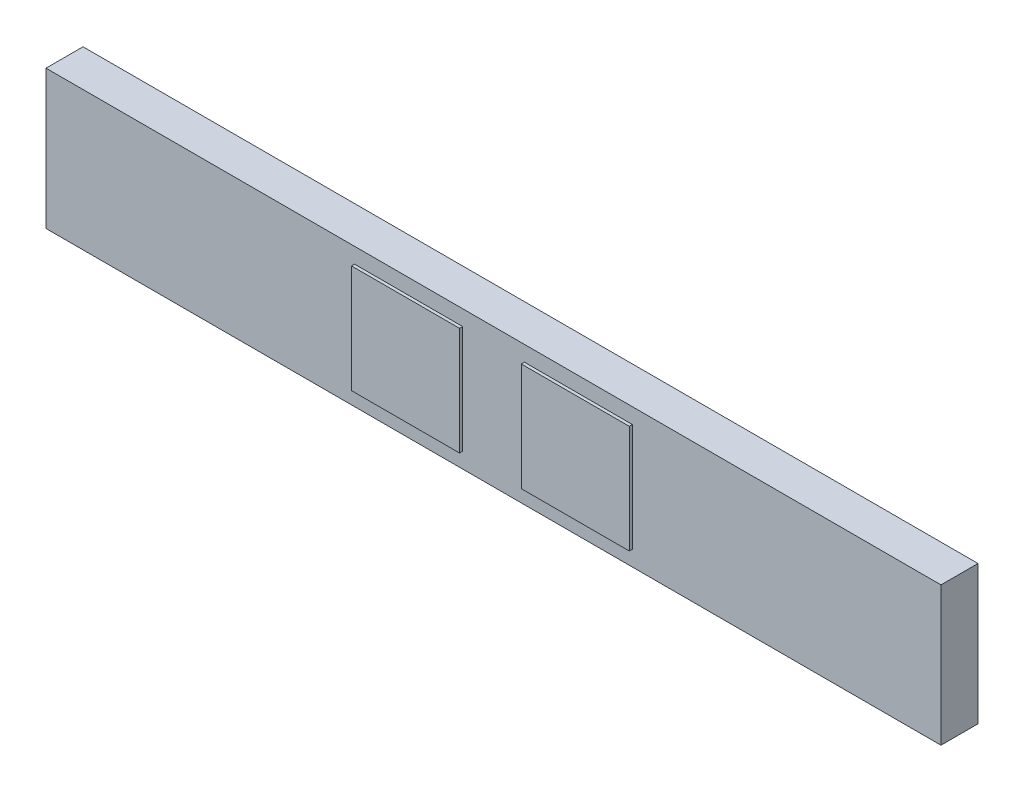
ISO-10303-21;
HEADER;
FILE_DESCRIPTION(('STEP AP214'),'2;1');
FILE_NAME('part.step','',(''),(''),'','','');
FILE_SCHEMA(('AUTOMOTIVE_DESIGN { 1 0 10303 214 1 1 1 1 }'));
ENDSEC;
DATA;
#1=APPLICATION_CONTEXT('core data for automotive mechanical design processes');
#2=APPLICATION_PROTOCOL_DEFINITION('international standard','automotive_design',2000,#1);
#3=PRODUCT_CONTEXT('',#1,'mechanical');
#4=PRODUCT('Part','Part','',(#3));
#5=PRODUCT_RELATED_PRODUCT_CATEGORY('part','',(#4));
#6=PRODUCT_DEFINITION_FORMATION('','',#4);
#7=PRODUCT_DEFINITION_CONTEXT('part definition',#1,'design');
#8=PRODUCT_DEFINITION('design','',#6,#7);
#9=PRODUCT_DEFINITION_SHAPE('','',#8);
#10=(LENGTH_UNIT() NAMED_UNIT(*) SI_UNIT(.MILLI.,.METRE.));
#11=(NAMED_UNIT(*) PLANE_ANGLE_UNIT() SI_UNIT($,.RADIAN.));
#12=(NAMED_UNIT(*) SI_UNIT($,.STERADIAN.) SOLID_ANGLE_UNIT());
#13=UNCERTAINTY_MEASURE_WITH_UNIT(LENGTH_MEASURE(1.E-05),#10,'distance_accuracy_value','');
#14=(GEOMETRIC_REPRESENTATION_CONTEXT(3) GLOBAL_UNCERTAINTY_ASSIGNED_CONTEXT((#13)) GLOBAL_UNIT_ASSIGNED_CONTEXT((#10,
#11,#12)) REPRESENTATION_CONTEXT('',''));
#15=CARTESIAN_POINT('',(0.,0.,0.));
#16=DIRECTION('',(0.,0.,1.));
#17=DIRECTION('',(1.,0.,0.));
#18=AXIS2_PLACEMENT_3D('',#15,#16,#17);
#19=CARTESIAN_POINT('',(-14.5000000000116,12.5,3.7));
#20=DIRECTION('',(0.,0.,1.));
#21=DIRECTION('',(1.,0.,0.));
#22=AXIS2_PLACEMENT_3D('',#19,#20,#21);
#23=PLANE('',#22);
#24=DIRECTION('',(-1.,0.,0.));
#25=VECTOR('',#24,1.);
#26=CARTESIAN_POINT('',(4.5000000000029,16.5,3.7));
#27=LINE('',#26,#25);
#28=CARTESIAN_POINT('',(4.5000000000029,16.5,3.7));
#29=VERTEX_POINT('',#28);
#30=CARTESIAN_POINT('',(1.0000000000029,16.5,3.7));
#31=VERTEX_POINT('',#30);
#32=EDGE_CURVE('E156',#29,#31,#27,.T.);
#33=ORIENTED_EDGE('',*,*,#32,.F.);
#34=DIRECTION('',(0.,1.,0.));
#35=VECTOR('',#34,1.);
#36=CARTESIAN_POINT('',(4.5000000000029,13.,3.7));
#37=LINE('',#36,#35);
#38=CARTESIAN_POINT('',(4.5000000000029,13.,3.7));
#39=VERTEX_POINT('',#38);
#40=EDGE_CURVE('E153',#39,#29,#37,.T.);
#41=ORIENTED_EDGE('',*,*,#40,.F.);
#42=DIRECTION('',(1.,0.,0.));
#43=VECTOR('',#42,1.);
#44=CARTESIAN_POINT('',(4.5000000000029,13.,3.7));
#45=LINE('',#44,#43);
#46=CARTESIAN_POINT('',(1.0000000000029,13.,3.7));
#47=VERTEX_POINT('',#46);
#48=EDGE_CURVE('E165',#47,#39,#45,.T.);
#49=ORIENTED_EDGE('',*,*,#48,.F.);
#50=DIRECTION('',(0.,-1.,0.));
#51=VECTOR('',#50,1.);
#52=CARTESIAN_POINT('',(1.0000000000029,13.,3.7));
#53=LINE('',#52,#51);
#54=EDGE_CURVE('E173',#31,#47,#53,.T.);
#55=ORIENTED_EDGE('',*,*,#54,.F.);
#56=EDGE_LOOP('',(#33,#41,#49,#55));
#57=FACE_BOUND('',#56,.T.);
#58=DIRECTION('',(0.,1.,0.));
#59=VECTOR('',#58,1.);
#60=CARTESIAN_POINT('',(14.5000000000116,14.7500000000058,3.7));
#61=LINE('',#60,#59);
#62=CARTESIAN_POINT('',(14.5000000000029,12.5,3.7));
#63=VERTEX_POINT('',#62);
#64=CARTESIAN_POINT('',(14.5000000000116,17.0000000000116,3.7));
#65=VERTEX_POINT('',#64);
#66=EDGE_CURVE('E186',#63,#65,#61,.T.);
#67=ORIENTED_EDGE('',*,*,#66,.T.);
#68=DIRECTION('',(1.,0.,0.));
#69=VECTOR('',#68,1.);
#70=CARTESIAN_POINT('',(0.,17.0000000000116,3.7));
#71=LINE('',#70,#69);
#72=CARTESIAN_POINT('',(-14.5000000000116,17.0000000000116,3.7));
#73=VERTEX_POINT('',#72);
#74=EDGE_CURVE('E11',#73,#65,#71,.T.);
#75=ORIENTED_EDGE('',*,*,#74,.F.);
#76=DIRECTION('',(0.,-1.,0.));
#77=VECTOR('',#76,1.);
#78=CARTESIAN_POINT('',(-14.5000000000116,14.7500000000058,3.7));
#79=LINE('',#78,#77);
#80=CARTESIAN_POINT('',(-14.5000000000116,12.5,3.7));
#81=VERTEX_POINT('',#80);
#82=EDGE_CURVE('E192',#73,#81,#79,.T.);
#83=ORIENTED_EDGE('',*,*,#82,.T.);
#84=DIRECTION('',(1.,0.,0.));
#85=VECTOR('',#84,1.);
#86=CARTESIAN_POINT('',(0.,12.5,3.7));
#87=LINE('',#86,#85);
#88=EDGE_CURVE('E189',#81,#63,#87,.T.);
#89=ORIENTED_EDGE('',*,*,#88,.T.);
#90=EDGE_LOOP('',(#67,#75,#83,#89));
#91=FACE_BOUND('',#90,.T.);
#92=DIRECTION('',(-1.,0.,0.));
#93=VECTOR('',#92,1.);
#94=CARTESIAN_POINT('',(-1.0000000000116,16.5,3.7));
#95=LINE('',#94,#93);
#96=CARTESIAN_POINT('',(-1.0000000000116,16.5,3.7));
#97=VERTEX_POINT('',#96);
#98=CARTESIAN_POINT('',(-4.5000000000116,16.5,3.7));
#99=VERTEX_POINT('',#98);
#100=EDGE_CURVE('E383',#97,#99,#95,.T.);
#101=ORIENTED_EDGE('',*,*,#100,.F.);
#102=DIRECTION('',(0.,1.,0.));
#103=VECTOR('',#102,1.);
#104=CARTESIAN_POINT('',(-1.0000000000116,13.,3.7));
#105=LINE('',#104,#103);
#106=CARTESIAN_POINT('',(-1.0000000000116,13.,3.7));
#107=VERTEX_POINT('',#106);
#108=EDGE_CURVE('E151',#107,#97,#105,.T.);
#109=ORIENTED_EDGE('',*,*,#108,.F.);
#110=DIRECTION('',(1.,0.,0.));
#111=VECTOR('',#110,1.);
#112=CARTESIAN_POINT('',(-1.0000000000116,13.,3.7));
#113=LINE('',#112,#111);
#114=CARTESIAN_POINT('',(-4.5000000000116,13.,3.7));
#115=VERTEX_POINT('',#114);
#116=EDGE_CURVE('E147',#115,#107,#113,.T.);
#117=ORIENTED_EDGE('',*,*,#116,.F.);
#118=DIRECTION('',(0.,-1.,0.));
#119=VECTOR('',#118,1.);
#120=CARTESIAN_POINT('',(-4.5000000000116,13.,3.7));
#121=LINE('',#120,#119);
#122=EDGE_CURVE('E380',#99,#115,#121,.T.);
#123=ORIENTED_EDGE('',*,*,#122,.F.);
#124=EDGE_LOOP('',(#101,#109,#117,#123));
#125=FACE_BOUND('',#124,.T.);
#126=ADVANCED_FACE('F36',(#57,#91,#125),#23,.T.);
#127=CARTESIAN_POINT('',(-14.5000000000116,17.0000000000116,2.5));
#128=DIRECTION('',(-1.,0.,0.));
#129=DIRECTION('',(0.,-1.,0.));
#130=AXIS2_PLACEMENT_3D('',#127,#128,#129);
#131=PLANE('',#130);
#132=ORIENTED_EDGE('',*,*,#82,.F.);
#133=DIRECTION('',(0.,0.,-1.));
#134=VECTOR('',#133,1.);
#135=CARTESIAN_POINT('',(-14.5000000000116,17.0000000000116,3.1));
#136=LINE('',#135,#134);
#137=CARTESIAN_POINT('',(-14.5000000000116,17.0000000000116,2.5));
#138=VERTEX_POINT('',#137);
#139=EDGE_CURVE('E40',#73,#138,#136,.T.);
#140=ORIENTED_EDGE('',*,*,#139,.T.);
#141=DIRECTION('',(0.,1.,0.));
#142=VECTOR('',#141,1.);
#143=CARTESIAN_POINT('',(-14.5000000000116,14.7500000000058,2.5));
#144=LINE('',#143,#142);
#145=CARTESIAN_POINT('',(-14.5000000000116,12.5,2.5));
#146=VERTEX_POINT('',#145);
#147=EDGE_CURVE('E201',#146,#138,#144,.T.);
#148=ORIENTED_EDGE('',*,*,#147,.F.);
#149=DIRECTION('',(0.,0.,-1.));
#150=VECTOR('',#149,1.);
#151=CARTESIAN_POINT('',(-14.5000000000116,12.5,3.1));
#152=LINE('',#151,#150);
#153=EDGE_CURVE('E207',#81,#146,#152,.T.);
#154=ORIENTED_EDGE('',*,*,#153,.F.);
#155=EDGE_LOOP('',(#132,#140,#148,#154));
#156=FACE_BOUND('',#155,.T.);
#157=ADVANCED_FACE('F214',(#156),#131,.T.);
#158=CARTESIAN_POINT('',(-14.5000000000116,12.5,2.5));
#159=DIRECTION('',(0.,-1.,0.));
#160=DIRECTION('',(1.,0.,0.));
#161=AXIS2_PLACEMENT_3D('',#158,#159,#160);
#162=PLANE('',#161);
#163=ORIENTED_EDGE('',*,*,#88,.F.);
#164=ORIENTED_EDGE('',*,*,#153,.T.);
#165=DIRECTION('',(-1.,0.,0.));
#166=VECTOR('',#165,1.);
#167=CARTESIAN_POINT('',(0.,12.5,2.5));
#168=LINE('',#167,#166);
#169=CARTESIAN_POINT('',(14.5000000000029,12.5,2.5));
#170=VERTEX_POINT('',#169);
#171=EDGE_CURVE('E195',#170,#146,#168,.T.);
#172=ORIENTED_EDGE('',*,*,#171,.F.);
#173=DIRECTION('',(0.,0.,-1.));
#174=VECTOR('',#173,1.);
#175=CARTESIAN_POINT('',(14.5,12.5,3.1));
#176=LINE('',#175,#174);
#177=EDGE_CURVE('E204',#63,#170,#176,.T.);
#178=ORIENTED_EDGE('',*,*,#177,.F.);
#179=EDGE_LOOP('',(#163,#164,#172,#178));
#180=FACE_BOUND('',#179,.T.);
#181=ADVANCED_FACE('F224',(#180),#162,.T.);
#182=CARTESIAN_POINT('',(14.5,12.5,2.5));
#183=DIRECTION('',(1.,-2.57741359118912E-12,0.));
#184=DIRECTION('',(2.57741359118912E-12,1.,0.));
#185=AXIS2_PLACEMENT_3D('',#182,#183,#184);
#186=PLANE('',#185);
#187=ORIENTED_EDGE('',*,*,#66,.F.);
#188=ORIENTED_EDGE('',*,*,#177,.T.);
#189=DIRECTION('',(0.,-1.,0.));
#190=VECTOR('',#189,1.);
#191=CARTESIAN_POINT('',(14.5000000000116,14.7500000000058,2.5));
#192=LINE('',#191,#190);
#193=CARTESIAN_POINT('',(14.5000000000116,17.0000000000116,2.5));
#194=VERTEX_POINT('',#193);
#195=EDGE_CURVE('E198',#194,#170,#192,.T.);
#196=ORIENTED_EDGE('',*,*,#195,.F.);
#197=DIRECTION('',(0.,0.,1.));
#198=VECTOR('',#197,1.);
#199=CARTESIAN_POINT('',(14.5000000000116,17.0000000000116,3.1));
#200=LINE('',#199,#198);
#201=EDGE_CURVE('E206',#194,#65,#200,.T.);
#202=ORIENTED_EDGE('',*,*,#201,.T.);
#203=EDGE_LOOP('',(#187,#188,#196,#202));
#204=FACE_BOUND('',#203,.T.);
#205=ADVANCED_FACE('F223',(#204),#186,.T.);
#206=CARTESIAN_POINT('',(14.5000000000116,12.5,2.5));
#207=DIRECTION('',(0.,0.,-1.));
#208=DIRECTION('',(-1.,0.,0.));
#209=AXIS2_PLACEMENT_3D('',#206,#207,#208);
#210=PLANE('',#209);
#211=ORIENTED_EDGE('',*,*,#195,.T.);
#212=ORIENTED_EDGE('',*,*,#171,.T.);
#213=ORIENTED_EDGE('',*,*,#147,.T.);
#214=DIRECTION('',(-1.,0.,0.));
#215=VECTOR('',#214,1.);
#216=CARTESIAN_POINT('',(0.,17.0000000000116,2.5));
#217=LINE('',#216,#215);
#218=EDGE_CURVE('E45',#194,#138,#217,.T.);
#219=ORIENTED_EDGE('',*,*,#218,.F.);
#220=EDGE_LOOP('',(#211,#212,#213,#219));
#221=FACE_BOUND('',#220,.T.);
#222=ADVANCED_FACE('F219',(#221),#210,.T.);
#223=CARTESIAN_POINT('',(14.5000000000116,17.0000000000116,2.5));
#224=DIRECTION('',(0.,1.,0.));
#225=DIRECTION('',(-1.,0.,0.));
#226=AXIS2_PLACEMENT_3D('',#223,#224,#225);
#227=PLANE('',#226);
#228=ORIENTED_EDGE('',*,*,#74,.T.);
#229=ORIENTED_EDGE('',*,*,#201,.F.);
#230=ORIENTED_EDGE('',*,*,#218,.T.);
#231=ORIENTED_EDGE('',*,*,#139,.F.);
#232=EDGE_LOOP('',(#228,#229,#230,#231));
#233=FACE_BOUND('',#232,.T.);
#234=ADVANCED_FACE('F38',(#233),#227,.T.);
#235=CARTESIAN_POINT('',(4.5000000000029,13.,3.8));
#236=DIRECTION('',(-1.,0.,0.));
#237=DIRECTION('',(0.,-1.,0.));
#238=AXIS2_PLACEMENT_3D('',#235,#236,#237);
#239=PLANE('',#238);
#240=ORIENTED_EDGE('',*,*,#40,.T.);
#241=DIRECTION('',(0.,0.,-1.));
#242=VECTOR('',#241,1.);
#243=CARTESIAN_POINT('',(4.5000000000029,16.5,3.8));
#244=LINE('',#243,#242);
#245=CARTESIAN_POINT('',(4.5000000000029,16.5,3.8));
#246=VERTEX_POINT('',#245);
#247=EDGE_CURVE('E182',#246,#29,#244,.T.);
#248=ORIENTED_EDGE('',*,*,#247,.F.);
#249=DIRECTION('',(0.,1.,0.));
#250=VECTOR('',#249,1.);
#251=CARTESIAN_POINT('',(4.5000000000029,13.,3.8));
#252=LINE('',#251,#250);
#253=CARTESIAN_POINT('',(4.5000000000029,13.,3.8));
#254=VERTEX_POINT('',#253);
#255=EDGE_CURVE('E161',#254,#246,#252,.T.);
#256=ORIENTED_EDGE('',*,*,#255,.F.);
#257=DIRECTION('',(0.,0.,-1.));
#258=VECTOR('',#257,1.);
#259=CARTESIAN_POINT('',(4.5000000000029,13.,3.8));
#260=LINE('',#259,#258);
#261=EDGE_CURVE('E170',#254,#39,#260,.T.);
#262=ORIENTED_EDGE('',*,*,#261,.T.);
#263=EDGE_LOOP('',(#240,#248,#256,#262));
#264=FACE_BOUND('',#263,.T.);
#265=ADVANCED_FACE('F233',(#264),#239,.F.);
#266=CARTESIAN_POINT('',(4.5000000000029,16.5,3.8));
#267=DIRECTION('',(0.,-1.,0.));
#268=DIRECTION('',(0.,0.,-1.));
#269=AXIS2_PLACEMENT_3D('',#266,#267,#268);
#270=PLANE('',#269);
#271=ORIENTED_EDGE('',*,*,#32,.T.);
#272=DIRECTION('',(0.,0.,-1.));
#273=VECTOR('',#272,1.);
#274=CARTESIAN_POINT('',(1.0000000000029,16.5,3.8));
#275=LINE('',#274,#273);
#276=CARTESIAN_POINT('',(1.0000000000029,16.5,3.8));
#277=VERTEX_POINT('',#276);
#278=EDGE_CURVE('E179',#277,#31,#275,.T.);
#279=ORIENTED_EDGE('',*,*,#278,.F.);
#280=DIRECTION('',(-1.,0.,0.));
#281=VECTOR('',#280,1.);
#282=CARTESIAN_POINT('',(4.5000000000029,16.5,3.8));
#283=LINE('',#282,#281);
#284=EDGE_CURVE('E164',#246,#277,#283,.T.);
#285=ORIENTED_EDGE('',*,*,#284,.F.);
#286=ORIENTED_EDGE('',*,*,#247,.T.);
#287=EDGE_LOOP('',(#271,#279,#285,#286));
#288=FACE_BOUND('',#287,.T.);
#289=ADVANCED_FACE('F246',(#288),#270,.F.);
#290=CARTESIAN_POINT('',(1.0000000000029,13.,3.8));
#291=DIRECTION('',(1.,0.,0.));
#292=DIRECTION('',(0.,0.,-1.));
#293=AXIS2_PLACEMENT_3D('',#290,#291,#292);
#294=PLANE('',#293);
#295=ORIENTED_EDGE('',*,*,#54,.T.);
#296=DIRECTION('',(0.,0.,-1.));
#297=VECTOR('',#296,1.);
#298=CARTESIAN_POINT('',(1.0000000000029,13.,3.8));
#299=LINE('',#298,#297);
#300=CARTESIAN_POINT('',(1.0000000000029,13.,3.8));
#301=VERTEX_POINT('',#300);
#302=EDGE_CURVE('E61',#301,#47,#299,.T.);
#303=ORIENTED_EDGE('',*,*,#302,.F.);
#304=DIRECTION('',(0.,-1.,0.));
#305=VECTOR('',#304,1.);
#306=CARTESIAN_POINT('',(1.0000000000029,13.,3.8));
#307=LINE('',#306,#305);
#308=EDGE_CURVE('E167',#277,#301,#307,.T.);
#309=ORIENTED_EDGE('',*,*,#308,.F.);
#310=ORIENTED_EDGE('',*,*,#278,.T.);
#311=EDGE_LOOP('',(#295,#303,#309,#310));
#312=FACE_BOUND('',#311,.T.);
#313=ADVANCED_FACE('F298',(#312),#294,.F.);
#314=CARTESIAN_POINT('',(4.5000000000029,13.,3.8));
#315=DIRECTION('',(0.,1.,0.));
#316=DIRECTION('',(-1.,0.,0.));
#317=AXIS2_PLACEMENT_3D('',#314,#315,#316);
#318=PLANE('',#317);
#319=ORIENTED_EDGE('',*,*,#48,.T.);
#320=ORIENTED_EDGE('',*,*,#261,.F.);
#321=DIRECTION('',(1.,0.,0.));
#322=VECTOR('',#321,1.);
#323=CARTESIAN_POINT('',(4.5000000000029,13.,3.8));
#324=LINE('',#323,#322);
#325=EDGE_CURVE('E169',#301,#254,#324,.T.);
#326=ORIENTED_EDGE('',*,*,#325,.F.);
#327=ORIENTED_EDGE('',*,*,#302,.T.);
#328=EDGE_LOOP('',(#319,#320,#326,#327));
#329=FACE_BOUND('',#328,.T.);
#330=ADVANCED_FACE('F308',(#329),#318,.F.);
#331=CARTESIAN_POINT('',(0.,0.,3.8));
#332=DIRECTION('',(0.,0.,1.));
#333=DIRECTION('',(1.,0.,0.));
#334=AXIS2_PLACEMENT_3D('',#331,#332,#333);
#335=PLANE('',#334);
#336=ORIENTED_EDGE('',*,*,#255,.T.);
#337=ORIENTED_EDGE('',*,*,#284,.T.);
#338=ORIENTED_EDGE('',*,*,#308,.T.);
#339=ORIENTED_EDGE('',*,*,#325,.T.);
#340=EDGE_LOOP('',(#336,#337,#338,#339));
#341=FACE_BOUND('',#340,.T.);
#342=ADVANCED_FACE('F318',(#341),#335,.T.);
#343=CARTESIAN_POINT('',(-1.0000000000116,13.,3.8));
#344=DIRECTION('',(-1.,0.,0.));
#345=DIRECTION('',(0.,0.,1.));
#346=AXIS2_PLACEMENT_3D('',#343,#344,#345);
#347=PLANE('',#346);
#348=ORIENTED_EDGE('',*,*,#108,.T.);
#349=DIRECTION('',(0.,0.,-1.));
#350=VECTOR('',#349,1.);
#351=CARTESIAN_POINT('',(-1.0000000000116,16.5,3.8));
#352=LINE('',#351,#350);
#353=CARTESIAN_POINT('',(-1.0000000000116,16.5,3.8));
#354=VERTEX_POINT('',#353);
#355=EDGE_CURVE('E132',#354,#97,#352,.T.);
#356=ORIENTED_EDGE('',*,*,#355,.F.);
#357=DIRECTION('',(0.,1.,0.));
#358=VECTOR('',#357,1.);
#359=CARTESIAN_POINT('',(-1.0000000000116,13.,3.8));
#360=LINE('',#359,#358);
#361=CARTESIAN_POINT('',(-1.0000000000116,13.,3.8));
#362=VERTEX_POINT('',#361);
#363=EDGE_CURVE('E139',#362,#354,#360,.T.);
#364=ORIENTED_EDGE('',*,*,#363,.F.);
#365=DIRECTION('',(0.,0.,-1.));
#366=VECTOR('',#365,1.);
#367=CARTESIAN_POINT('',(-1.0000000000116,13.,3.8));
#368=LINE('',#367,#366);
#369=EDGE_CURVE('E377',#362,#107,#368,.T.);
#370=ORIENTED_EDGE('',*,*,#369,.T.);
#371=EDGE_LOOP('',(#348,#356,#364,#370));
#372=FACE_BOUND('',#371,.T.);
#373=ADVANCED_FACE('F149',(#372),#347,.F.);
#374=CARTESIAN_POINT('',(-1.0000000000116,16.5,3.8));
#375=DIRECTION('',(0.,-1.,0.));
#376=DIRECTION('',(1.,0.,0.));
#377=AXIS2_PLACEMENT_3D('',#374,#375,#376);
#378=PLANE('',#377);
#379=ORIENTED_EDGE('',*,*,#100,.T.);
#380=DIRECTION('',(0.,0.,-1.));
#381=VECTOR('',#380,1.);
#382=CARTESIAN_POINT('',(-4.5000000000116,16.5,3.8));
#383=LINE('',#382,#381);
#384=CARTESIAN_POINT('',(-4.5000000000116,16.5,3.8));
#385=VERTEX_POINT('',#384);
#386=EDGE_CURVE('E135',#385,#99,#383,.T.);
#387=ORIENTED_EDGE('',*,*,#386,.F.);
#388=DIRECTION('',(-1.,0.,0.));
#389=VECTOR('',#388,1.);
#390=CARTESIAN_POINT('',(-1.0000000000116,16.5,3.8));
#391=LINE('',#390,#389);
#392=EDGE_CURVE('E128',#354,#385,#391,.T.);
#393=ORIENTED_EDGE('',*,*,#392,.F.);
#394=ORIENTED_EDGE('',*,*,#355,.T.);
#395=EDGE_LOOP('',(#379,#387,#393,#394));
#396=FACE_BOUND('',#395,.T.);
#397=ADVANCED_FACE('F130',(#396),#378,.F.);
#398=CARTESIAN_POINT('',(-4.5000000000116,13.,3.8));
#399=DIRECTION('',(1.,0.,0.));
#400=DIRECTION('',(0.,1.,0.));
#401=AXIS2_PLACEMENT_3D('',#398,#399,#400);
#402=PLANE('',#401);
#403=ORIENTED_EDGE('',*,*,#122,.T.);
#404=DIRECTION('',(0.,0.,-1.));
#405=VECTOR('',#404,1.);
#406=CARTESIAN_POINT('',(-4.5000000000116,13.,3.8));
#407=LINE('',#406,#405);
#408=CARTESIAN_POINT('',(-4.5000000000116,13.,3.8));
#409=VERTEX_POINT('',#408);
#410=EDGE_CURVE('E53',#409,#115,#407,.T.);
#411=ORIENTED_EDGE('',*,*,#410,.F.);
#412=DIRECTION('',(0.,-1.,0.));
#413=VECTOR('',#412,1.);
#414=CARTESIAN_POINT('',(-4.5000000000116,13.,3.8));
#415=LINE('',#414,#413);
#416=EDGE_CURVE('E138',#385,#409,#415,.T.);
#417=ORIENTED_EDGE('',*,*,#416,.F.);
#418=ORIENTED_EDGE('',*,*,#386,.T.);
#419=EDGE_LOOP('',(#403,#411,#417,#418));
#420=FACE_BOUND('',#419,.T.);
#421=ADVANCED_FACE('F345',(#420),#402,.F.);
#422=CARTESIAN_POINT('',(-1.0000000000116,13.,3.8));
#423=DIRECTION('',(0.,1.,0.));
#424=DIRECTION('',(-1.,0.,0.));
#425=AXIS2_PLACEMENT_3D('',#422,#423,#424);
#426=PLANE('',#425);
#427=ORIENTED_EDGE('',*,*,#116,.T.);
#428=ORIENTED_EDGE('',*,*,#369,.F.);
#429=DIRECTION('',(1.,0.,0.));
#430=VECTOR('',#429,1.);
#431=CARTESIAN_POINT('',(-1.0000000000116,13.,3.8));
#432=LINE('',#431,#430);
#433=EDGE_CURVE('E143',#409,#362,#432,.T.);
#434=ORIENTED_EDGE('',*,*,#433,.F.);
#435=ORIENTED_EDGE('',*,*,#410,.T.);
#436=EDGE_LOOP('',(#427,#428,#434,#435));
#437=FACE_BOUND('',#436,.T.);
#438=ADVANCED_FACE('F354',(#437),#426,.F.);
#439=CARTESIAN_POINT('',(0.,0.,3.8));
#440=DIRECTION('',(0.,0.,1.));
#441=DIRECTION('',(1.,0.,0.));
#442=AXIS2_PLACEMENT_3D('',#439,#440,#441);
#443=PLANE('',#442);
#444=ORIENTED_EDGE('',*,*,#363,.T.);
#445=ORIENTED_EDGE('',*,*,#392,.T.);
#446=ORIENTED_EDGE('',*,*,#416,.T.);
#447=ORIENTED_EDGE('',*,*,#433,.T.);
#448=EDGE_LOOP('',(#444,#445,#446,#447));
#449=FACE_BOUND('',#448,.T.);
#450=ADVANCED_FACE('F142',(#449),#443,.T.);
#451=CLOSED_SHELL('',(#126,#157,#181,#205,#222,#234,#265,#289,#313,#330,#342,#373,#397,#421,
#438,#450));
#452=MANIFOLD_SOLID_BREP('B2',#451);
#453=ADVANCED_BREP_SHAPE_REPRESENTATION('',(#18,#452),#14);
#454=SHAPE_DEFINITION_REPRESENTATION(#9,#453);
ENDSEC;
END-ISO-10303-21;
